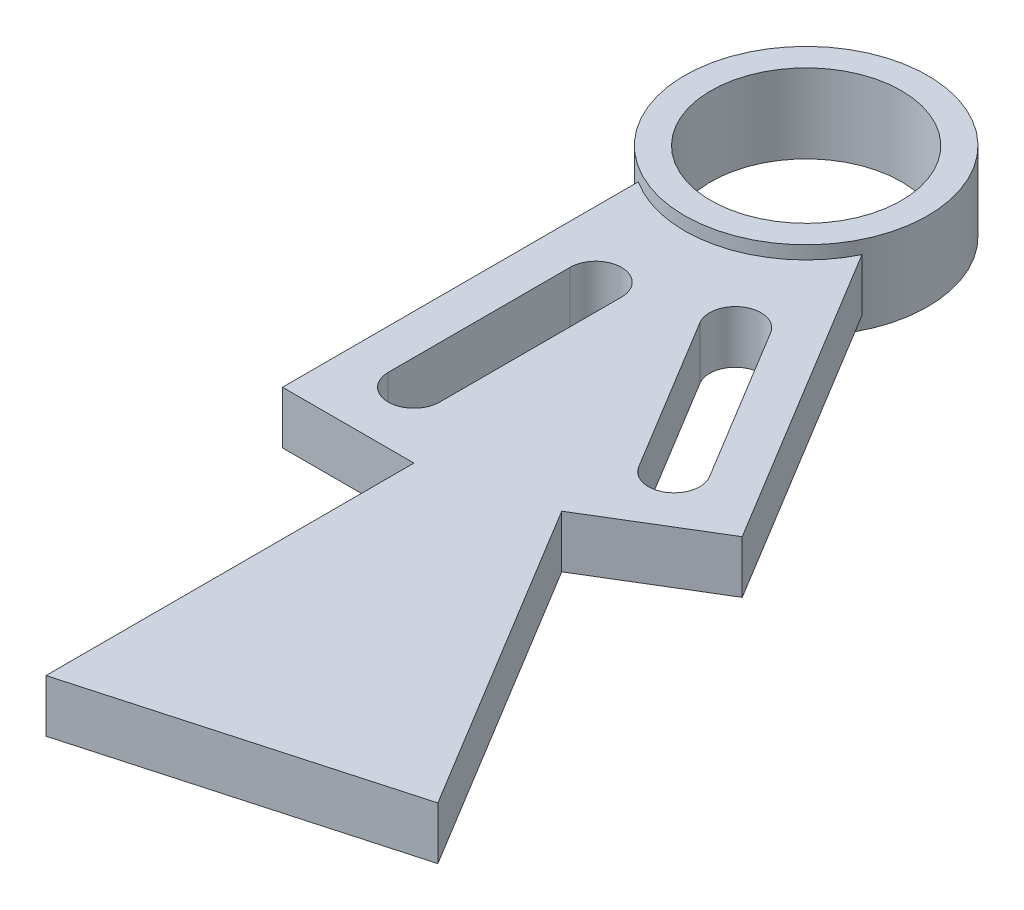
ISO-10303-21;
HEADER;
FILE_DESCRIPTION(('STEP AP214'),'2;1');
FILE_NAME('part.step','',(''),(''),'','','');
FILE_SCHEMA(('AUTOMOTIVE_DESIGN { 1 0 10303 214 1 1 1 1 }'));
ENDSEC;
DATA;
#1=APPLICATION_CONTEXT('core data for automotive mechanical design processes');
#2=APPLICATION_PROTOCOL_DEFINITION('international standard','automotive_design',2000,#1);
#3=PRODUCT_CONTEXT('',#1,'mechanical');
#4=PRODUCT('Part','Part','',(#3));
#5=PRODUCT_RELATED_PRODUCT_CATEGORY('part','',(#4));
#6=PRODUCT_DEFINITION_FORMATION('','',#4);
#7=PRODUCT_DEFINITION_CONTEXT('part definition',#1,'design');
#8=PRODUCT_DEFINITION('design','',#6,#7);
#9=PRODUCT_DEFINITION_SHAPE('','',#8);
#10=(LENGTH_UNIT() NAMED_UNIT(*) SI_UNIT(.MILLI.,.METRE.));
#11=(NAMED_UNIT(*) PLANE_ANGLE_UNIT() SI_UNIT($,.RADIAN.));
#12=(NAMED_UNIT(*) SI_UNIT($,.STERADIAN.) SOLID_ANGLE_UNIT());
#13=UNCERTAINTY_MEASURE_WITH_UNIT(LENGTH_MEASURE(1.E-05),#10,'distance_accuracy_value','');
#14=(GEOMETRIC_REPRESENTATION_CONTEXT(3) GLOBAL_UNCERTAINTY_ASSIGNED_CONTEXT((#13)) GLOBAL_UNIT_ASSIGNED_CONTEXT((#10,
#11,#12)) REPRESENTATION_CONTEXT('',''));
#15=CARTESIAN_POINT('',(0.,0.,0.));
#16=DIRECTION('',(0.,0.,1.));
#17=DIRECTION('',(1.,0.,0.));
#18=AXIS2_PLACEMENT_3D('',#15,#16,#17);
#19=CARTESIAN_POINT('',(0.,4.7625,0.));
#20=DIRECTION('',(0.,-1.,0.));
#21=DIRECTION('',(0.,0.,-1.));
#22=AXIS2_PLACEMENT_3D('',#19,#20,#21);
#23=CYLINDRICAL_SURFACE('',#22,11.5062);
#24=CARTESIAN_POINT('',(0.,4.7625,0.));
#25=DIRECTION('',(0.,1.,0.));
#26=DIRECTION('',(0.,0.,1.));
#27=AXIS2_PLACEMENT_3D('',#24,#25,#26);
#28=CIRCLE('',#27,11.5062);
#29=CARTESIAN_POINT('',(0.,4.7625,-11.5062));
#30=VERTEX_POINT('',#29);
#31=EDGE_CURVE('E53',#30,#30,#28,.T.);
#32=CARTESIAN_POINT('',(0.,-4.7625,0.));
#33=DIRECTION('',(0.,1.,0.));
#34=DIRECTION('',(0.,0.,1.));
#35=AXIS2_PLACEMENT_3D('',#32,#33,#34);
#36=CIRCLE('',#35,11.5062);
#37=CARTESIAN_POINT('',(0.,-4.7625,-11.5062));
#38=VERTEX_POINT('',#37);
#39=EDGE_CURVE('E273',#38,#38,#36,.T.);
#40=CARTESIAN_POINT('',(0.,4.7625,-11.5062));
#41=CARTESIAN_POINT('',(0.,4.66328125,-11.5062));
#42=CARTESIAN_POINT('',(0.,4.5640625,-11.5062));
#43=CARTESIAN_POINT('',(0.,4.365625,-11.5062));
#44=CARTESIAN_POINT('',(0.,4.26640625,-11.5062));
#45=CARTESIAN_POINT('',(0.,4.06796875,-11.5062));
#46=CARTESIAN_POINT('',(0.,3.96875,-11.5062));
#47=CARTESIAN_POINT('',(0.,3.7703125,-11.5062));
#48=CARTESIAN_POINT('',(0.,3.67109375,-11.5062));
#49=CARTESIAN_POINT('',(0.,3.47265625,-11.5062));
#50=CARTESIAN_POINT('',(0.,3.3734375,-11.5062));
#51=CARTESIAN_POINT('',(0.,3.175,-11.5062));
#52=CARTESIAN_POINT('',(0.,3.07578125,-11.5062));
#53=CARTESIAN_POINT('',(0.,2.87734375,-11.5062));
#54=CARTESIAN_POINT('',(0.,2.778125,-11.5062));
#55=CARTESIAN_POINT('',(0.,2.5796875,-11.5062));
#56=CARTESIAN_POINT('',(0.,2.48046875,-11.5062));
#57=CARTESIAN_POINT('',(0.,2.28203125,-11.5062));
#58=CARTESIAN_POINT('',(0.,2.1828125,-11.5062));
#59=CARTESIAN_POINT('',(0.,1.984375,-11.5062));
#60=CARTESIAN_POINT('',(0.,1.88515625,-11.5062));
#61=CARTESIAN_POINT('',(0.,1.68671875,-11.5062));
#62=CARTESIAN_POINT('',(0.,1.5875,-11.5062));
#63=CARTESIAN_POINT('',(0.,1.3890625,-11.5062));
#64=CARTESIAN_POINT('',(0.,1.28984375,-11.5062));
#65=CARTESIAN_POINT('',(0.,1.09140625,-11.5062));
#66=CARTESIAN_POINT('',(0.,0.992187499999999,-11.5062));
#67=CARTESIAN_POINT('',(0.,0.79375,-11.5062));
#68=CARTESIAN_POINT('',(0.,0.69453125,-11.5062));
#69=CARTESIAN_POINT('',(0.,0.49609375,-11.5062));
#70=CARTESIAN_POINT('',(0.,0.396875,-11.5062));
#71=CARTESIAN_POINT('',(0.,0.1984375,-11.5062));
#72=CARTESIAN_POINT('',(0.,0.0992187500000001,-11.5062));
#73=CARTESIAN_POINT('',(0.,-0.0992187500000001,-11.5062));
#74=CARTESIAN_POINT('',(0.,-0.1984375,-11.5062));
#75=CARTESIAN_POINT('',(0.,-0.396875,-11.5062));
#76=CARTESIAN_POINT('',(0.,-0.49609375,-11.5062));
#77=CARTESIAN_POINT('',(0.,-0.69453125,-11.5062));
#78=CARTESIAN_POINT('',(0.,-0.793750000000001,-11.5062));
#79=CARTESIAN_POINT('',(0.,-0.992187500000001,-11.5062));
#80=CARTESIAN_POINT('',(0.,-1.09140625,-11.5062));
#81=CARTESIAN_POINT('',(0.,-1.28984375,-11.5062));
#82=CARTESIAN_POINT('',(0.,-1.3890625,-11.5062));
#83=CARTESIAN_POINT('',(0.,-1.5875,-11.5062));
#84=CARTESIAN_POINT('',(0.,-1.68671875,-11.5062));
#85=CARTESIAN_POINT('',(0.,-1.88515625,-11.5062));
#86=CARTESIAN_POINT('',(0.,-1.984375,-11.5062));
#87=CARTESIAN_POINT('',(0.,-2.1828125,-11.5062));
#88=CARTESIAN_POINT('',(0.,-2.28203125,-11.5062));
#89=CARTESIAN_POINT('',(0.,-2.48046875,-11.5062));
#90=CARTESIAN_POINT('',(0.,-2.5796875,-11.5062));
#91=CARTESIAN_POINT('',(0.,-2.778125,-11.5062));
#92=CARTESIAN_POINT('',(0.,-2.87734375,-11.5062));
#93=CARTESIAN_POINT('',(0.,-3.07578125,-11.5062));
#94=CARTESIAN_POINT('',(0.,-3.175,-11.5062));
#95=CARTESIAN_POINT('',(0.,-3.3734375,-11.5062));
#96=CARTESIAN_POINT('',(0.,-3.47265625,-11.5062));
#97=CARTESIAN_POINT('',(0.,-3.67109375,-11.5062));
#98=CARTESIAN_POINT('',(0.,-3.7703125,-11.5062));
#99=CARTESIAN_POINT('',(0.,-3.96875,-11.5062));
#100=CARTESIAN_POINT('',(0.,-4.06796875,-11.5062));
#101=CARTESIAN_POINT('',(0.,-4.26640625,-11.5062));
#102=CARTESIAN_POINT('',(0.,-4.365625,-11.5062));
#103=CARTESIAN_POINT('',(0.,-4.5640625,-11.5062));
#104=CARTESIAN_POINT('',(0.,-4.66328125,-11.5062));
#105=CARTESIAN_POINT('',(0.,-4.7625,-11.5062));
#106=B_SPLINE_CURVE_WITH_KNOTS('',3,(#40,#41,#42,#43,#44,#45,#46,#47,#48,#49,#50,#51,#52,#53,
#54,#55,#56,#57,#58,#59,#60,#61,#62,#63,#64,#65,#66,#67,#68,#69,#70,#71,#72,#73,#74,#75,#76,#77,
#78,#79,#80,#81,#82,#83,#84,#85,#86,#87,#88,#89,#90,#91,#92,#93,#94,#95,#96,#97,#98,#99,#100,
#101,#102,#103,#104,#105),.UNSPECIFIED.,.F.,.F.,(4,2,2,2,2,2,2,2,2,2,2,2,2,2,2,2,2,2,2,2,2,2,2,
2,2,2,2,2,2,2,2,2,4),(0.,0.29765625,0.5953125,0.892968750000001,1.190625,1.48828125,1.7859375,
2.08359375,2.38125,2.67890625,2.9765625,3.27421875,3.571875,3.86953125,4.1671875,4.46484375,
4.7625,5.06015625,5.3578125,5.65546875,5.953125,6.25078125,6.5484375,6.84609375,7.14375,
7.44140625,7.7390625,8.03671875,8.334375,8.63203125,8.9296875,9.22734375,9.525),.UNSPECIFIED.);
#107=EDGE_CURVE('BSEAM45',#30,#38,#106,.T.);
#108=ORIENTED_EDGE('',*,*,#31,.T.);
#109=ORIENTED_EDGE('',*,*,#39,.F.);
#110=ORIENTED_EDGE('',*,*,#107,.T.);
#111=ORIENTED_EDGE('',*,*,#107,.F.);
#112=EDGE_LOOP('',(#108,#110,#109,#111));
#113=FACE_BOUND('',#112,.T.);
#114=ADVANCED_FACE('F45',(#113),#23,.F.);
#115=CARTESIAN_POINT('',(0.,4.7625,0.));
#116=DIRECTION('',(0.,-1.,0.));
#117=DIRECTION('',(0.,0.,-1.));
#118=AXIS2_PLACEMENT_3D('',#115,#116,#117);
#119=CYLINDRICAL_SURFACE('',#118,14.6812);
#120=DIRECTION('',(0.,-1.,0.));
#121=VECTOR('',#120,1.);
#122=CARTESIAN_POINT('',(-7.93749999999998,3.175,12.3504545337409));
#123=LINE('',#122,#121);
#124=CARTESIAN_POINT('',(-7.93749999999998,3.175,12.3504545337409));
#125=VERTEX_POINT('',#124);
#126=CARTESIAN_POINT('',(-7.93749999999998,-3.175,12.3504545337409));
#127=VERTEX_POINT('',#126);
#128=EDGE_CURVE('E66',#125,#127,#123,.T.);
#129=ORIENTED_EDGE('',*,*,#128,.F.);
#130=CARTESIAN_POINT('',(0.,3.175,0.));
#131=DIRECTION('',(0.,1.,0.));
#132=DIRECTION('',(0.,0.,1.));
#133=AXIS2_PLACEMENT_3D('',#130,#131,#132);
#134=CIRCLE('',#133,14.6812);
#135=CARTESIAN_POINT('',(13.1903459382538,3.175,6.446115688474));
#136=VERTEX_POINT('',#135);
#137=EDGE_CURVE('E61',#125,#136,#134,.T.);
#138=ORIENTED_EDGE('',*,*,#137,.T.);
#139=DIRECTION('',(0.,-1.,0.));
#140=VECTOR('',#139,1.);
#141=CARTESIAN_POINT('',(13.1903459382538,3.175,6.446115688474));
#142=LINE('',#141,#140);
#143=CARTESIAN_POINT('',(13.1903459382538,-3.175,6.446115688474));
#144=VERTEX_POINT('',#143);
#145=EDGE_CURVE('E284',#136,#144,#142,.T.);
#146=ORIENTED_EDGE('',*,*,#145,.T.);
#147=CARTESIAN_POINT('',(0.,-3.175,0.));
#148=DIRECTION('',(0.,1.,0.));
#149=DIRECTION('',(0.,0.,1.));
#150=AXIS2_PLACEMENT_3D('',#147,#148,#149);
#151=CIRCLE('',#150,14.6812);
#152=EDGE_CURVE('E238',#127,#144,#151,.T.);
#153=ORIENTED_EDGE('',*,*,#152,.F.);
#154=EDGE_LOOP('',(#129,#138,#146,#153));
#155=FACE_BOUND('',#154,.T.);
#156=CARTESIAN_POINT('',(0.,4.7625,0.));
#157=DIRECTION('',(0.,1.,0.));
#158=DIRECTION('',(0.,0.,1.));
#159=AXIS2_PLACEMENT_3D('',#156,#157,#158);
#160=CIRCLE('',#159,14.6812);
#161=CARTESIAN_POINT('',(0.,4.7625,14.6812));
#162=VERTEX_POINT('',#161);
#163=EDGE_CURVE('E11',#162,#162,#160,.T.);
#164=ORIENTED_EDGE('',*,*,#163,.F.);
#165=EDGE_LOOP('',(#164));
#166=FACE_BOUND('',#165,.T.);
#167=CARTESIAN_POINT('',(0.,-4.7625,0.));
#168=DIRECTION('',(0.,1.,0.));
#169=DIRECTION('',(0.,0.,1.));
#170=AXIS2_PLACEMENT_3D('',#167,#168,#169);
#171=CIRCLE('',#170,14.6812);
#172=CARTESIAN_POINT('',(0.,-4.7625,14.6812));
#173=VERTEX_POINT('',#172);
#174=EDGE_CURVE('E48',#173,#173,#171,.T.);
#175=ORIENTED_EDGE('',*,*,#174,.T.);
#176=EDGE_LOOP('',(#175));
#177=FACE_BOUND('',#176,.T.);
#178=ADVANCED_FACE('F301',(#155,#166,#177),#119,.T.);
#179=CARTESIAN_POINT('',(0.,4.7625,0.));
#180=DIRECTION('',(0.,1.,0.));
#181=DIRECTION('',(0.,0.,1.));
#182=AXIS2_PLACEMENT_3D('',#179,#180,#181);
#183=PLANE('',#182);
#184=ORIENTED_EDGE('',*,*,#31,.F.);
#185=EDGE_LOOP('',(#184));
#186=FACE_BOUND('',#185,.T.);
#187=ORIENTED_EDGE('',*,*,#163,.T.);
#188=EDGE_LOOP('',(#187));
#189=FACE_BOUND('',#188,.T.);
#190=ADVANCED_FACE('F306',(#186,#189),#183,.T.);
#191=CARTESIAN_POINT('',(0.,-4.7625,0.));
#192=DIRECTION('',(0.,1.,0.));
#193=DIRECTION('',(0.,0.,1.));
#194=AXIS2_PLACEMENT_3D('',#191,#192,#193);
#195=PLANE('',#194);
#196=ORIENTED_EDGE('',*,*,#39,.T.);
#197=EDGE_LOOP('',(#196));
#198=FACE_BOUND('',#197,.T.);
#199=ORIENTED_EDGE('',*,*,#174,.F.);
#200=EDGE_LOOP('',(#199));
#201=FACE_BOUND('',#200,.T.);
#202=ADVANCED_FACE('F303',(#198,#201),#195,.F.);
#203=CARTESIAN_POINT('',(0.,3.175,25.4127));
#204=DIRECTION('',(0.,-1.,0.));
#205=DIRECTION('',(0.,0.,-1.));
#206=AXIS2_PLACEMENT_3D('',#203,#204,#205);
#207=CYLINDRICAL_SURFACE('',#206,3.1115);
#208=CARTESIAN_POINT('',(0.,-3.175,25.4127));
#209=DIRECTION('',(0.,1.,0.));
#210=DIRECTION('',(0.,0.,1.));
#211=AXIS2_PLACEMENT_3D('',#208,#209,#210);
#212=CIRCLE('',#211,3.1115);
#213=CARTESIAN_POINT('',(3.1115,-3.175,25.4127));
#214=VERTEX_POINT('',#213);
#215=CARTESIAN_POINT('',(-3.11150000000001,-3.175,25.4127));
#216=VERTEX_POINT('',#215);
#217=EDGE_CURVE('E253',#214,#216,#212,.T.);
#218=ORIENTED_EDGE('',*,*,#217,.F.);
#219=DIRECTION('',(0.,-1.,0.));
#220=VECTOR('',#219,1.);
#221=CARTESIAN_POINT('',(3.1115,3.175,25.4127));
#222=LINE('',#221,#220);
#223=CARTESIAN_POINT('',(3.1115,3.175,25.4127));
#224=VERTEX_POINT('',#223);
#225=EDGE_CURVE('E271',#224,#214,#222,.T.);
#226=ORIENTED_EDGE('',*,*,#225,.F.);
#227=CARTESIAN_POINT('',(0.,3.175,25.4127));
#228=DIRECTION('',(0.,1.,0.));
#229=DIRECTION('',(0.,0.,1.));
#230=AXIS2_PLACEMENT_3D('',#227,#228,#229);
#231=CIRCLE('',#230,3.1115);
#232=CARTESIAN_POINT('',(-3.11150000000001,3.175,25.4127));
#233=VERTEX_POINT('',#232);
#234=EDGE_CURVE('E208',#224,#233,#231,.T.);
#235=ORIENTED_EDGE('',*,*,#234,.T.);
#236=DIRECTION('',(0.,-1.,0.));
#237=VECTOR('',#236,1.);
#238=CARTESIAN_POINT('',(-3.11150000000001,3.175,25.4127));
#239=LINE('',#238,#237);
#240=EDGE_CURVE('E264',#233,#216,#239,.T.);
#241=ORIENTED_EDGE('',*,*,#240,.T.);
#242=EDGE_LOOP('',(#218,#226,#235,#241));
#243=FACE_BOUND('',#242,.T.);
#244=ADVANCED_FACE('F305',(#243),#207,.F.);
#245=CARTESIAN_POINT('',(3.11149999999999,3.175,0.));
#246=DIRECTION('',(-1.,0.,0.));
#247=DIRECTION('',(0.,0.,1.));
#248=AXIS2_PLACEMENT_3D('',#245,#246,#247);
#249=PLANE('',#248);
#250=DIRECTION('',(0.,0.,-1.));
#251=VECTOR('',#250,1.);
#252=CARTESIAN_POINT('',(3.11149999999999,-3.175,0.));
#253=LINE('',#252,#251);
#254=CARTESIAN_POINT('',(3.1115,-3.175,47.3837));
#255=VERTEX_POINT('',#254);
#256=EDGE_CURVE('E256',#255,#214,#253,.T.);
#257=ORIENTED_EDGE('',*,*,#256,.F.);
#258=DIRECTION('',(0.,-1.,0.));
#259=VECTOR('',#258,1.);
#260=CARTESIAN_POINT('',(3.1115,3.175,47.3837));
#261=LINE('',#260,#259);
#262=CARTESIAN_POINT('',(3.1115,3.175,47.3837));
#263=VERTEX_POINT('',#262);
#264=EDGE_CURVE('E269',#263,#255,#261,.T.);
#265=ORIENTED_EDGE('',*,*,#264,.F.);
#266=DIRECTION('',(0.,0.,-1.));
#267=VECTOR('',#266,1.);
#268=CARTESIAN_POINT('',(3.11149999999999,3.175,0.));
#269=LINE('',#268,#267);
#270=EDGE_CURVE('E211',#263,#224,#269,.T.);
#271=ORIENTED_EDGE('',*,*,#270,.T.);
#272=ORIENTED_EDGE('',*,*,#225,.T.);
#273=EDGE_LOOP('',(#257,#265,#271,#272));
#274=FACE_BOUND('',#273,.T.);
#275=ADVANCED_FACE('F313',(#274),#249,.T.);
#276=CARTESIAN_POINT('',(0.,3.175,47.3837));
#277=DIRECTION('',(0.,-1.,0.));
#278=DIRECTION('',(0.,0.,-1.));
#279=AXIS2_PLACEMENT_3D('',#276,#277,#278);
#280=CYLINDRICAL_SURFACE('',#279,3.1115);
#281=CARTESIAN_POINT('',(0.,-3.175,47.3837));
#282=DIRECTION('',(0.,1.,0.));
#283=DIRECTION('',(0.,0.,1.));
#284=AXIS2_PLACEMENT_3D('',#281,#282,#283);
#285=CIRCLE('',#284,3.1115);
#286=CARTESIAN_POINT('',(-3.1115,-3.175,47.3837));
#287=VERTEX_POINT('',#286);
#288=EDGE_CURVE('E259',#287,#255,#285,.T.);
#289=ORIENTED_EDGE('',*,*,#288,.F.);
#290=DIRECTION('',(0.,-1.,0.));
#291=VECTOR('',#290,1.);
#292=CARTESIAN_POINT('',(-3.1115,3.175,47.3837));
#293=LINE('',#292,#291);
#294=CARTESIAN_POINT('',(-3.1115,3.175,47.3837));
#295=VERTEX_POINT('',#294);
#296=EDGE_CURVE('E266',#295,#287,#293,.T.);
#297=ORIENTED_EDGE('',*,*,#296,.F.);
#298=CARTESIAN_POINT('',(0.,3.175,47.3837));
#299=DIRECTION('',(0.,1.,0.));
#300=DIRECTION('',(0.,0.,1.));
#301=AXIS2_PLACEMENT_3D('',#298,#299,#300);
#302=CIRCLE('',#301,3.1115);
#303=EDGE_CURVE('E214',#295,#263,#302,.T.);
#304=ORIENTED_EDGE('',*,*,#303,.T.);
#305=ORIENTED_EDGE('',*,*,#264,.T.);
#306=EDGE_LOOP('',(#289,#297,#304,#305));
#307=FACE_BOUND('',#306,.T.);
#308=ADVANCED_FACE('F342',(#307),#280,.F.);
#309=CARTESIAN_POINT('',(-6.7875256247226,3.175,4.1150215240914));
#310=DIRECTION('',(0.85512133854772,0.,-0.518427908546942));
#311=DIRECTION('',(-0.518427908546942,0.,-0.85512133854772));
#312=AXIS2_PLACEMENT_3D('',#309,#310,#311);
#313=PLANE('',#312);
#314=DIRECTION('',(0.518427908546942,0.,0.85512133854772));
#315=VECTOR('',#314,1.);
#316=CARTESIAN_POINT('',(-6.7875256247226,-3.175,4.1150215240914));
#317=LINE('',#316,#315);
#318=CARTESIAN_POINT('',(21.8925283895844,-3.175,51.4213601181575));
#319=VERTEX_POINT('',#318);
#320=CARTESIAN_POINT('',(44.936648924496,-3.175,89.4315036166036));
#321=VERTEX_POINT('',#320);
#322=EDGE_CURVE('E229',#319,#321,#317,.T.);
#323=ORIENTED_EDGE('',*,*,#322,.F.);
#324=DIRECTION('',(0.,-1.,0.));
#325=VECTOR('',#324,1.);
#326=CARTESIAN_POINT('',(21.8925283895844,3.175,51.4213601181575));
#327=LINE('',#326,#325);
#328=CARTESIAN_POINT('',(21.8925283895844,3.175,51.4213601181575));
#329=VERTEX_POINT('',#328);
#330=EDGE_CURVE('E267',#329,#319,#327,.T.);
#331=ORIENTED_EDGE('',*,*,#330,.F.);
#332=DIRECTION('',(0.518427908546942,0.,0.85512133854772));
#333=VECTOR('',#332,1.);
#334=CARTESIAN_POINT('',(-6.7875256247226,3.175,4.1150215240914));
#335=LINE('',#334,#333);
#336=CARTESIAN_POINT('',(44.936648924496,3.175,89.4315036166036));
#337=VERTEX_POINT('',#336);
#338=EDGE_CURVE('E188',#329,#337,#335,.T.);
#339=ORIENTED_EDGE('',*,*,#338,.T.);
#340=DIRECTION('',(0.,-1.,0.));
#341=VECTOR('',#340,1.);
#342=CARTESIAN_POINT('',(44.936648924496,3.175,89.4315036166036));
#343=LINE('',#342,#341);
#344=EDGE_CURVE('E167',#337,#321,#343,.T.);
#345=ORIENTED_EDGE('',*,*,#344,.T.);
#346=EDGE_LOOP('',(#323,#331,#339,#345));
#347=FACE_BOUND('',#346,.T.);
#348=ADVANCED_FACE('F351',(#347),#313,.T.);
#349=CARTESIAN_POINT('',(28.680054014307,3.175,47.306338594066));
#350=DIRECTION('',(-0.518427908546942,0.,-0.85512133854772));
#351=DIRECTION('',(-0.85512133854772,0.,0.518427908546942));
#352=AXIS2_PLACEMENT_3D('',#349,#350,#351);
#353=PLANE('',#352);
#354=DIRECTION('',(0.85512133854772,0.,-0.518427908546942));
#355=VECTOR('',#354,1.);
#356=CARTESIAN_POINT('',(28.680054014307,-3.175,47.306338594066));
#357=LINE('',#356,#355);
#358=CARTESIAN_POINT('',(35.4675796390295,-3.175,43.1913170699748));
#359=VERTEX_POINT('',#358);
#360=EDGE_CURVE('E232',#319,#359,#357,.T.);
#361=ORIENTED_EDGE('',*,*,#360,.T.);
#362=DIRECTION('',(0.,-1.,0.));
#363=VECTOR('',#362,1.);
#364=CARTESIAN_POINT('',(35.4675796390295,3.175,43.1913170699748));
#365=LINE('',#364,#363);
#366=CARTESIAN_POINT('',(35.4675796390295,3.175,43.1913170699748));
#367=VERTEX_POINT('',#366);
#368=EDGE_CURVE('E286',#367,#359,#365,.T.);
#369=ORIENTED_EDGE('',*,*,#368,.F.);
#370=DIRECTION('',(0.85512133854772,0.,-0.518427908546942));
#371=VECTOR('',#370,1.);
#372=CARTESIAN_POINT('',(28.680054014307,3.175,47.306338594066));
#373=LINE('',#372,#371);
#374=EDGE_CURVE('E191',#329,#367,#373,.T.);
#375=ORIENTED_EDGE('',*,*,#374,.F.);
#376=ORIENTED_EDGE('',*,*,#330,.T.);
#377=EDGE_LOOP('',(#361,#369,#375,#376));
#378=FACE_BOUND('',#377,.T.);
#379=ADVANCED_FACE('F360',(#378),#353,.F.);
#380=CARTESIAN_POINT('',(6.78752562472242,3.175,-4.11502152409129));
#381=DIRECTION('',(-0.85512133854772,0.,0.518427908546942));
#382=DIRECTION('',(0.518427908546942,0.,0.85512133854772));
#383=AXIS2_PLACEMENT_3D('',#380,#381,#382);
#384=PLANE('',#383);
#385=DIRECTION('',(-0.518427908546942,0.,-0.85512133854772));
#386=VECTOR('',#385,1.);
#387=CARTESIAN_POINT('',(6.78752562472242,-3.175,-4.11502152409129));
#388=LINE('',#387,#386);
#389=EDGE_CURVE('E235',#359,#144,#388,.T.);
#390=ORIENTED_EDGE('',*,*,#389,.T.);
#391=ORIENTED_EDGE('',*,*,#145,.F.);
#392=DIRECTION('',(-0.518427908546942,0.,-0.85512133854772));
#393=VECTOR('',#392,1.);
#394=CARTESIAN_POINT('',(6.78752562472242,3.175,-4.11502152409129));
#395=LINE('',#394,#393);
#396=EDGE_CURVE('E194',#367,#136,#395,.T.);
#397=ORIENTED_EDGE('',*,*,#396,.F.);
#398=ORIENTED_EDGE('',*,*,#368,.T.);
#399=EDGE_LOOP('',(#390,#391,#397,#398));
#400=FACE_BOUND('',#399,.T.);
#401=ADVANCED_FACE('F369',(#400),#384,.F.);
#402=CARTESIAN_POINT('',(-7.93749999999998,3.175,0.));
#403=DIRECTION('',(-1.,0.,0.));
#404=DIRECTION('',(0.,0.,1.));
#405=AXIS2_PLACEMENT_3D('',#402,#403,#404);
#406=PLANE('',#405);
#407=DIRECTION('',(0.,0.,-1.));
#408=VECTOR('',#407,1.);
#409=CARTESIAN_POINT('',(-7.93749999999998,-3.175,0.));
#410=LINE('',#409,#408);
#411=CARTESIAN_POINT('',(-7.93749999999998,-3.175,55.3212));
#412=VERTEX_POINT('',#411);
#413=EDGE_CURVE('E241',#412,#127,#410,.T.);
#414=ORIENTED_EDGE('',*,*,#413,.F.);
#415=DIRECTION('',(0.,-1.,0.));
#416=VECTOR('',#415,1.);
#417=CARTESIAN_POINT('',(-7.93749999999998,3.175,55.3212));
#418=LINE('',#417,#416);
#419=CARTESIAN_POINT('',(-7.93749999999998,3.175,55.3212));
#420=VERTEX_POINT('',#419);
#421=EDGE_CURVE('E281',#420,#412,#418,.T.);
#422=ORIENTED_EDGE('',*,*,#421,.F.);
#423=DIRECTION('',(0.,0.,-1.));
#424=VECTOR('',#423,1.);
#425=CARTESIAN_POINT('',(-7.93749999999998,3.175,0.));
#426=LINE('',#425,#424);
#427=EDGE_CURVE('E197',#420,#125,#426,.T.);
#428=ORIENTED_EDGE('',*,*,#427,.T.);
#429=ORIENTED_EDGE('',*,*,#128,.T.);
#430=EDGE_LOOP('',(#414,#422,#428,#429));
#431=FACE_BOUND('',#430,.T.);
#432=ADVANCED_FACE('F378',(#431),#406,.T.);
#433=CARTESIAN_POINT('',(0.,3.175,55.3212));
#434=DIRECTION('',(0.,0.,-1.));
#435=DIRECTION('',(-1.,0.,0.));
#436=AXIS2_PLACEMENT_3D('',#433,#434,#435);
#437=PLANE('',#436);
#438=DIRECTION('',(1.,0.,0.));
#439=VECTOR('',#438,1.);
#440=CARTESIAN_POINT('',(0.,-3.175,55.3212));
#441=LINE('',#440,#439);
#442=CARTESIAN_POINT('',(7.93750000000002,-3.175,55.3212));
#443=VERTEX_POINT('',#442);
#444=EDGE_CURVE('E244',#412,#443,#441,.T.);
#445=ORIENTED_EDGE('',*,*,#444,.T.);
#446=DIRECTION('',(0.,-1.,0.));
#447=VECTOR('',#446,1.);
#448=CARTESIAN_POINT('',(7.93750000000002,3.175,55.3212));
#449=LINE('',#448,#447);
#450=CARTESIAN_POINT('',(7.93750000000002,3.175,55.3212));
#451=VERTEX_POINT('',#450);
#452=EDGE_CURVE('E278',#451,#443,#449,.T.);
#453=ORIENTED_EDGE('',*,*,#452,.F.);
#454=DIRECTION('',(1.,0.,0.));
#455=VECTOR('',#454,1.);
#456=CARTESIAN_POINT('',(0.,3.175,55.3212));
#457=LINE('',#456,#455);
#458=EDGE_CURVE('E200',#420,#451,#457,.T.);
#459=ORIENTED_EDGE('',*,*,#458,.F.);
#460=ORIENTED_EDGE('',*,*,#421,.T.);
#461=EDGE_LOOP('',(#445,#453,#459,#460));
#462=FACE_BOUND('',#461,.T.);
#463=ADVANCED_FACE('F387',(#462),#437,.F.);
#464=CARTESIAN_POINT('',(7.93750000000005,3.175,0.));
#465=DIRECTION('',(1.,0.,0.));
#466=DIRECTION('',(0.,0.,-1.));
#467=AXIS2_PLACEMENT_3D('',#464,#465,#466);
#468=PLANE('',#467);
#469=DIRECTION('',(0.,0.,1.));
#470=VECTOR('',#469,1.);
#471=CARTESIAN_POINT('',(7.93750000000005,-3.175,0.));
#472=LINE('',#471,#470);
#473=CARTESIAN_POINT('',(7.9375,-3.175,99.7712));
#474=VERTEX_POINT('',#473);
#475=EDGE_CURVE('E247',#443,#474,#472,.T.);
#476=ORIENTED_EDGE('',*,*,#475,.T.);
#477=DIRECTION('',(0.,-1.,0.));
#478=VECTOR('',#477,1.);
#479=CARTESIAN_POINT('',(7.9375,3.175,99.7712));
#480=LINE('',#479,#478);
#481=CARTESIAN_POINT('',(7.9375,3.175,99.7712));
#482=VERTEX_POINT('',#481);
#483=EDGE_CURVE('E275',#482,#474,#480,.T.);
#484=ORIENTED_EDGE('',*,*,#483,.F.);
#485=DIRECTION('',(0.,0.,1.));
#486=VECTOR('',#485,1.);
#487=CARTESIAN_POINT('',(7.93750000000005,3.175,0.));
#488=LINE('',#487,#486);
#489=EDGE_CURVE('E203',#451,#482,#488,.T.);
#490=ORIENTED_EDGE('',*,*,#489,.F.);
#491=ORIENTED_EDGE('',*,*,#452,.T.);
#492=EDGE_LOOP('',(#476,#484,#490,#491));
#493=FACE_BOUND('',#492,.T.);
#494=ADVANCED_FACE('F396',(#493),#468,.F.);
#495=CARTESIAN_POINT('',(24.5650324902156,3.175,40.5188129693436));
#496=DIRECTION('',(0.,-1.,0.));
#497=DIRECTION('',(0.,0.,-1.));
#498=AXIS2_PLACEMENT_3D('',#495,#496,#497);
#499=CYLINDRICAL_SURFACE('',#498,3.11149999999999);
#500=CARTESIAN_POINT('',(24.5650324902156,-3.175,40.5188129693436));
#501=DIRECTION('',(0.,1.,0.));
#502=DIRECTION('',(0.,0.,1.));
#503=AXIS2_PLACEMENT_3D('',#500,#501,#502);
#504=CIRCLE('',#503,3.11149999999999);
#505=CARTESIAN_POINT('',(21.9043224453244,-3.175,42.1319014067874));
#506=VERTEX_POINT('',#505);
#507=CARTESIAN_POINT('',(27.2257425351068,-3.175,38.9057245318998));
#508=VERTEX_POINT('',#507);
#509=EDGE_CURVE('E162',#506,#508,#504,.T.);
#510=ORIENTED_EDGE('',*,*,#509,.F.);
#511=DIRECTION('',(0.,-1.,0.));
#512=VECTOR('',#511,1.);
#513=CARTESIAN_POINT('',(21.9043224453244,3.175,42.1319014067874));
#514=LINE('',#513,#512);
#515=CARTESIAN_POINT('',(21.9043224453244,3.175,42.1319014067874));
#516=VERTEX_POINT('',#515);
#517=EDGE_CURVE('E157',#516,#506,#514,.T.);
#518=ORIENTED_EDGE('',*,*,#517,.F.);
#519=CARTESIAN_POINT('',(24.5650324902156,3.175,40.5188129693436));
#520=DIRECTION('',(0.,1.,0.));
#521=DIRECTION('',(0.,0.,1.));
#522=AXIS2_PLACEMENT_3D('',#519,#520,#521);
#523=CIRCLE('',#522,3.11149999999999);
#524=CARTESIAN_POINT('',(27.2257425351068,3.175,38.9057245318998));
#525=VERTEX_POINT('',#524);
#526=EDGE_CURVE('E160',#516,#525,#523,.T.);
#527=ORIENTED_EDGE('',*,*,#526,.T.);
#528=DIRECTION('',(0.,-1.,0.));
#529=VECTOR('',#528,1.);
#530=CARTESIAN_POINT('',(27.2257425351068,3.175,38.9057245318998));
#531=LINE('',#530,#529);
#532=EDGE_CURVE('E219',#525,#508,#531,.T.);
#533=ORIENTED_EDGE('',*,*,#532,.T.);
#534=EDGE_LOOP('',(#510,#518,#527,#533));
#535=FACE_BOUND('',#534,.T.);
#536=ADVANCED_FACE('F159',(#535),#499,.F.);
#537=CARTESIAN_POINT('',(-2.66071004489134,3.175,1.61308843744388));
#538=DIRECTION('',(0.855121338547719,0.,-0.518427908546942));
#539=DIRECTION('',(-0.518427908546942,0.,-0.855121338547719));
#540=AXIS2_PLACEMENT_3D('',#537,#538,#539);
#541=PLANE('',#540);
#542=DIRECTION('',(0.518427908546942,0.,0.855121338547719));
#543=VECTOR('',#542,1.);
#544=CARTESIAN_POINT('',(-2.66071004489134,-3.175,1.61308843744388));
#545=LINE('',#544,#543);
#546=CARTESIAN_POINT('',(10.5139428666395,-3.175,23.3440304775554));
#547=VERTEX_POINT('',#546);
#548=EDGE_CURVE('E221',#547,#506,#545,.T.);
#549=ORIENTED_EDGE('',*,*,#548,.F.);
#550=DIRECTION('',(0.,-1.,0.));
#551=VECTOR('',#550,1.);
#552=CARTESIAN_POINT('',(10.5139428666395,3.175,23.3440304775554));
#553=LINE('',#552,#551);
#554=CARTESIAN_POINT('',(10.5139428666395,3.175,23.3440304775554));
#555=VERTEX_POINT('',#554);
#556=EDGE_CURVE('E168',#555,#547,#553,.T.);
#557=ORIENTED_EDGE('',*,*,#556,.F.);
#558=DIRECTION('',(0.518427908546942,0.,0.855121338547719));
#559=VECTOR('',#558,1.);
#560=CARTESIAN_POINT('',(-2.66071004489134,3.175,1.61308843744388));
#561=LINE('',#560,#559);
#562=EDGE_CURVE('E175',#555,#516,#561,.T.);
#563=ORIENTED_EDGE('',*,*,#562,.T.);
#564=ORIENTED_EDGE('',*,*,#517,.T.);
#565=EDGE_LOOP('',(#549,#557,#563,#564));
#566=FACE_BOUND('',#565,.T.);
#567=ADVANCED_FACE('F182',(#566),#541,.T.);
#568=CARTESIAN_POINT('',(13.1746529115307,3.175,21.7309420401116));
#569=DIRECTION('',(0.,-1.,0.));
#570=DIRECTION('',(0.,0.,-1.));
#571=AXIS2_PLACEMENT_3D('',#568,#569,#570);
#572=CYLINDRICAL_SURFACE('',#571,3.1115);
#573=CARTESIAN_POINT('',(13.1746529115307,-3.175,21.7309420401116));
#574=DIRECTION('',(0.,1.,0.));
#575=DIRECTION('',(0.,0.,1.));
#576=AXIS2_PLACEMENT_3D('',#573,#574,#575);
#577=CIRCLE('',#576,3.1115);
#578=CARTESIAN_POINT('',(15.835362956422,-3.175,20.1178536026678));
#579=VERTEX_POINT('',#578);
#580=EDGE_CURVE('E223',#579,#547,#577,.T.);
#581=ORIENTED_EDGE('',*,*,#580,.F.);
#582=DIRECTION('',(0.,-1.,0.));
#583=VECTOR('',#582,1.);
#584=CARTESIAN_POINT('',(15.835362956422,3.175,20.1178536026678));
#585=LINE('',#584,#583);
#586=CARTESIAN_POINT('',(15.835362956422,3.175,20.1178536026678));
#587=VERTEX_POINT('',#586);
#588=EDGE_CURVE('E291',#587,#579,#585,.T.);
#589=ORIENTED_EDGE('',*,*,#588,.F.);
#590=CARTESIAN_POINT('',(13.1746529115307,3.175,21.7309420401116));
#591=DIRECTION('',(0.,1.,0.));
#592=DIRECTION('',(0.,0.,1.));
#593=AXIS2_PLACEMENT_3D('',#590,#591,#592);
#594=CIRCLE('',#593,3.1115);
#595=EDGE_CURVE('E183',#587,#555,#594,.T.);
#596=ORIENTED_EDGE('',*,*,#595,.T.);
#597=ORIENTED_EDGE('',*,*,#556,.T.);
#598=EDGE_LOOP('',(#581,#589,#596,#597));
#599=FACE_BOUND('',#598,.T.);
#600=ADVANCED_FACE('F420',(#599),#572,.F.);
#601=CARTESIAN_POINT('',(26.4370744622481,3.175,94.6013518083017));
#602=DIRECTION('',(-0.269145556764626,0.,-0.963099511615419));
#603=DIRECTION('',(-0.963099511615419,0.,0.269145556764626));
#604=AXIS2_PLACEMENT_3D('',#601,#602,#603);
#605=PLANE('',#604);
#606=DIRECTION('',(0.963099511615419,0.,-0.269145556764626));
#607=VECTOR('',#606,1.);
#608=CARTESIAN_POINT('',(26.4370744622481,-3.175,94.6013518083017));
#609=LINE('',#608,#607);
#610=EDGE_CURVE('E250',#474,#321,#609,.T.);
#611=ORIENTED_EDGE('',*,*,#610,.T.);
#612=ORIENTED_EDGE('',*,*,#344,.F.);
#613=DIRECTION('',(0.963099511615419,0.,-0.269145556764626));
#614=VECTOR('',#613,1.);
#615=CARTESIAN_POINT('',(26.4370744622481,3.175,94.6013518083017));
#616=LINE('',#615,#614);
#617=EDGE_CURVE('E206',#482,#337,#616,.T.);
#618=ORIENTED_EDGE('',*,*,#617,.F.);
#619=ORIENTED_EDGE('',*,*,#483,.T.);
#620=EDGE_LOOP('',(#611,#612,#618,#619));
#621=FACE_BOUND('',#620,.T.);
#622=ADVANCED_FACE('F428',(#621),#605,.F.);
#623=CARTESIAN_POINT('',(2.66071004489114,3.175,-1.61308843744375));
#624=DIRECTION('',(0.85512133854772,0.,-0.518427908546942));
#625=DIRECTION('',(-0.518427908546942,0.,-0.85512133854772));
#626=AXIS2_PLACEMENT_3D('',#623,#624,#625);
#627=PLANE('',#626);
#628=DIRECTION('',(0.518427908546942,0.,0.85512133854772));
#629=VECTOR('',#628,1.);
#630=CARTESIAN_POINT('',(2.66071004489114,-3.175,-1.61308843744375));
#631=LINE('',#630,#629);
#632=EDGE_CURVE('E226',#579,#508,#631,.T.);
#633=ORIENTED_EDGE('',*,*,#632,.T.);
#634=ORIENTED_EDGE('',*,*,#532,.F.);
#635=DIRECTION('',(0.518427908546942,0.,0.85512133854772));
#636=VECTOR('',#635,1.);
#637=CARTESIAN_POINT('',(2.66071004489114,3.175,-1.61308843744375));
#638=LINE('',#637,#636);
#639=EDGE_CURVE('E178',#587,#525,#638,.T.);
#640=ORIENTED_EDGE('',*,*,#639,.F.);
#641=ORIENTED_EDGE('',*,*,#588,.T.);
#642=EDGE_LOOP('',(#633,#634,#640,#641));
#643=FACE_BOUND('',#642,.T.);
#644=ADVANCED_FACE('F437',(#643),#627,.F.);
#645=CARTESIAN_POINT('',(-3.11150000000001,3.175,0.));
#646=DIRECTION('',(-1.,0.,0.));
#647=DIRECTION('',(0.,0.,1.));
#648=AXIS2_PLACEMENT_3D('',#645,#646,#647);
#649=PLANE('',#648);
#650=DIRECTION('',(0.,0.,-1.));
#651=VECTOR('',#650,1.);
#652=CARTESIAN_POINT('',(-3.11150000000001,-3.175,0.));
#653=LINE('',#652,#651);
#654=EDGE_CURVE('E180',#287,#216,#653,.T.);
#655=ORIENTED_EDGE('',*,*,#654,.T.);
#656=ORIENTED_EDGE('',*,*,#240,.F.);
#657=DIRECTION('',(0.,0.,-1.));
#658=VECTOR('',#657,1.);
#659=CARTESIAN_POINT('',(-3.11150000000001,3.175,0.));
#660=LINE('',#659,#658);
#661=EDGE_CURVE('E217',#295,#233,#660,.T.);
#662=ORIENTED_EDGE('',*,*,#661,.F.);
#663=ORIENTED_EDGE('',*,*,#296,.T.);
#664=EDGE_LOOP('',(#655,#656,#662,#663));
#665=FACE_BOUND('',#664,.T.);
#666=ADVANCED_FACE('F446',(#665),#649,.F.);
#667=CARTESIAN_POINT('',(0.,3.175,0.));
#668=DIRECTION('',(0.,1.,0.));
#669=DIRECTION('',(0.,0.,1.));
#670=AXIS2_PLACEMENT_3D('',#667,#668,#669);
#671=PLANE('',#670);
#672=ORIENTED_EDGE('',*,*,#526,.F.);
#673=ORIENTED_EDGE('',*,*,#562,.F.);
#674=ORIENTED_EDGE('',*,*,#595,.F.);
#675=ORIENTED_EDGE('',*,*,#639,.T.);
#676=EDGE_LOOP('',(#672,#673,#674,#675));
#677=FACE_BOUND('',#676,.T.);
#678=ORIENTED_EDGE('',*,*,#338,.F.);
#679=ORIENTED_EDGE('',*,*,#374,.T.);
#680=ORIENTED_EDGE('',*,*,#396,.T.);
#681=ORIENTED_EDGE('',*,*,#137,.F.);
#682=ORIENTED_EDGE('',*,*,#427,.F.);
#683=ORIENTED_EDGE('',*,*,#458,.T.);
#684=ORIENTED_EDGE('',*,*,#489,.T.);
#685=ORIENTED_EDGE('',*,*,#617,.T.);
#686=EDGE_LOOP('',(#678,#679,#680,#681,#682,#683,#684,#685));
#687=FACE_BOUND('',#686,.T.);
#688=ORIENTED_EDGE('',*,*,#234,.F.);
#689=ORIENTED_EDGE('',*,*,#270,.F.);
#690=ORIENTED_EDGE('',*,*,#303,.F.);
#691=ORIENTED_EDGE('',*,*,#661,.T.);
#692=EDGE_LOOP('',(#688,#689,#690,#691));
#693=FACE_BOUND('',#692,.T.);
#694=ADVANCED_FACE('F172',(#677,#687,#693),#671,.T.);
#695=CARTESIAN_POINT('',(0.,-3.175,0.));
#696=DIRECTION('',(0.,1.,0.));
#697=DIRECTION('',(0.,0.,1.));
#698=AXIS2_PLACEMENT_3D('',#695,#696,#697);
#699=PLANE('',#698);
#700=ORIENTED_EDGE('',*,*,#509,.T.);
#701=ORIENTED_EDGE('',*,*,#632,.F.);
#702=ORIENTED_EDGE('',*,*,#580,.T.);
#703=ORIENTED_EDGE('',*,*,#548,.T.);
#704=EDGE_LOOP('',(#700,#701,#702,#703));
#705=FACE_BOUND('',#704,.T.);
#706=ORIENTED_EDGE('',*,*,#322,.T.);
#707=ORIENTED_EDGE('',*,*,#610,.F.);
#708=ORIENTED_EDGE('',*,*,#475,.F.);
#709=ORIENTED_EDGE('',*,*,#444,.F.);
#710=ORIENTED_EDGE('',*,*,#413,.T.);
#711=ORIENTED_EDGE('',*,*,#152,.T.);
#712=ORIENTED_EDGE('',*,*,#389,.F.);
#713=ORIENTED_EDGE('',*,*,#360,.F.);
#714=EDGE_LOOP('',(#706,#707,#708,#709,#710,#711,#712,#713));
#715=FACE_BOUND('',#714,.T.);
#716=ORIENTED_EDGE('',*,*,#217,.T.);
#717=ORIENTED_EDGE('',*,*,#654,.F.);
#718=ORIENTED_EDGE('',*,*,#288,.T.);
#719=ORIENTED_EDGE('',*,*,#256,.T.);
#720=EDGE_LOOP('',(#716,#717,#718,#719));
#721=FACE_BOUND('',#720,.T.);
#722=ADVANCED_FACE('F463',(#705,#715,#721),#699,.F.);
#723=CLOSED_SHELL('',(#114,#178,#190,#202,#244,#275,#308,#348,#379,#401,#432,#463,#494,#536,
#567,#600,#622,#644,#666,#694,#722));
#724=MANIFOLD_SOLID_BREP('B2',#723);
#725=ADVANCED_BREP_SHAPE_REPRESENTATION('',(#18,#724),#14);
#726=SHAPE_DEFINITION_REPRESENTATION(#9,#725);
ENDSEC;
END-ISO-10303-21;
